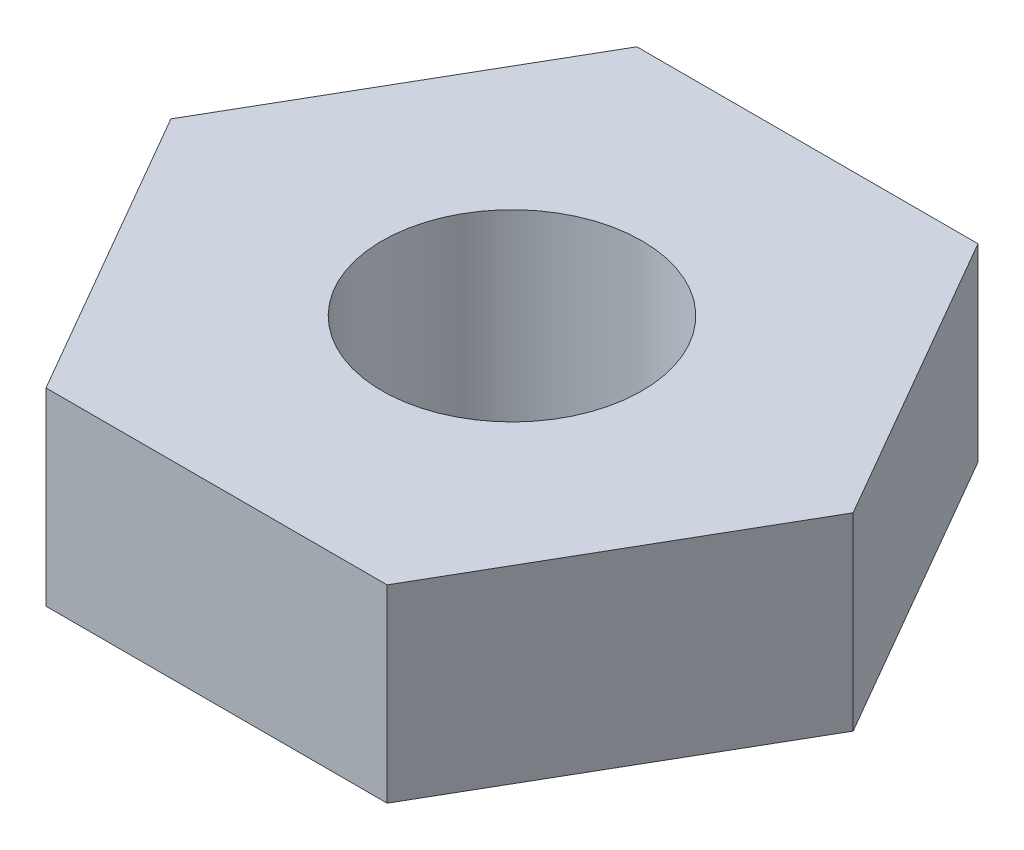
ISO-10303-21;
HEADER;
FILE_DESCRIPTION(('STEP AP214'),'2;1');
FILE_NAME('part.step','',(''),(''),'','','');
FILE_SCHEMA(('AUTOMOTIVE_DESIGN { 1 0 10303 214 1 1 1 1 }'));
ENDSEC;
DATA;
#1=APPLICATION_CONTEXT('core data for automotive mechanical design processes');
#2=APPLICATION_PROTOCOL_DEFINITION('international standard','automotive_design',2000,#1);
#3=PRODUCT_CONTEXT('',#1,'mechanical');
#4=PRODUCT('Part','Part','',(#3));
#5=PRODUCT_RELATED_PRODUCT_CATEGORY('part','',(#4));
#6=PRODUCT_DEFINITION_FORMATION('','',#4);
#7=PRODUCT_DEFINITION_CONTEXT('part definition',#1,'design');
#8=PRODUCT_DEFINITION('design','',#6,#7);
#9=PRODUCT_DEFINITION_SHAPE('','',#8);
#10=(LENGTH_UNIT() NAMED_UNIT(*) SI_UNIT(.MILLI.,.METRE.));
#11=(NAMED_UNIT(*) PLANE_ANGLE_UNIT() SI_UNIT($,.RADIAN.));
#12=(NAMED_UNIT(*) SI_UNIT($,.STERADIAN.) SOLID_ANGLE_UNIT());
#13=UNCERTAINTY_MEASURE_WITH_UNIT(LENGTH_MEASURE(1.E-05),#10,'distance_accuracy_value','');
#14=(GEOMETRIC_REPRESENTATION_CONTEXT(3) GLOBAL_UNCERTAINTY_ASSIGNED_CONTEXT((#13)) GLOBAL_UNIT_ASSIGNED_CONTEXT((#10,
#11,#12)) REPRESENTATION_CONTEXT('',''));
#15=CARTESIAN_POINT('',(0.,0.,0.));
#16=DIRECTION('',(0.,0.,1.));
#17=DIRECTION('',(1.,0.,0.));
#18=AXIS2_PLACEMENT_3D('',#15,#16,#17);
#19=CARTESIAN_POINT('',(0.72168793352628,0.8,-1.25000016807691));
#20=DIRECTION('',(0.,0.,1.));
#21=DIRECTION('',(1.,0.,0.));
#22=AXIS2_PLACEMENT_3D('',#19,#20,#21);
#23=PLANE('',#22);
#24=DIRECTION('',(-1.,0.,0.));
#25=VECTOR('',#24,1.);
#26=CARTESIAN_POINT('',(0.72168793352628,0.,-1.25000016807691));
#27=LINE('',#26,#25);
#28=CARTESIAN_POINT('',(0.72168793352628,0.,-1.25000016807691));
#29=VERTEX_POINT('',#28);
#30=CARTESIAN_POINT('',(-0.72168793352628,0.,-1.25000016807691));
#31=VERTEX_POINT('',#30);
#32=EDGE_CURVE('E116',#29,#31,#27,.T.);
#33=ORIENTED_EDGE('',*,*,#32,.T.);
#34=DIRECTION('',(0.,-1.,0.));
#35=VECTOR('',#34,1.);
#36=CARTESIAN_POINT('',(-0.72168793352628,0.8,-1.25000016807691));
#37=LINE('',#36,#35);
#38=CARTESIAN_POINT('',(-0.72168793352628,0.8,-1.25000016807691));
#39=VERTEX_POINT('',#38);
#40=EDGE_CURVE('E11',#39,#31,#37,.T.);
#41=ORIENTED_EDGE('',*,*,#40,.F.);
#42=DIRECTION('',(-1.,0.,0.));
#43=VECTOR('',#42,1.);
#44=CARTESIAN_POINT('',(0.72168793352628,0.8,-1.25000016807691));
#45=LINE('',#44,#43);
#46=CARTESIAN_POINT('',(0.72168793352628,0.8,-1.25000016807691));
#47=VERTEX_POINT('',#46);
#48=EDGE_CURVE('E127',#47,#39,#45,.T.);
#49=ORIENTED_EDGE('',*,*,#48,.F.);
#50=DIRECTION('',(0.,-1.,0.));
#51=VECTOR('',#50,1.);
#52=CARTESIAN_POINT('',(0.72168793352628,0.8,-1.25000016807691));
#53=LINE('',#52,#51);
#54=EDGE_CURVE('E112',#47,#29,#53,.T.);
#55=ORIENTED_EDGE('',*,*,#54,.T.);
#56=EDGE_LOOP('',(#33,#41,#49,#55));
#57=FACE_BOUND('',#56,.T.);
#58=ADVANCED_FACE('F32',(#57),#23,.F.);
#59=CARTESIAN_POINT('',(-0.72168793352628,0.8,-1.25000016807691));
#60=DIRECTION('',(0.866025403784439,0.,0.5));
#61=DIRECTION('',(0.5,0.,-0.866025403784439));
#62=AXIS2_PLACEMENT_3D('',#59,#60,#61);
#63=PLANE('',#62);
#64=DIRECTION('',(-0.5,0.,0.866025403784439));
#65=VECTOR('',#64,1.);
#66=CARTESIAN_POINT('',(-0.72168793352628,0.,-1.25000016807691));
#67=LINE('',#66,#65);
#68=CARTESIAN_POINT('',(-1.44337586705256,0.,0.));
#69=VERTEX_POINT('',#68);
#70=EDGE_CURVE('E119',#31,#69,#67,.T.);
#71=ORIENTED_EDGE('',*,*,#70,.T.);
#72=DIRECTION('',(0.,-1.,0.));
#73=VECTOR('',#72,1.);
#74=CARTESIAN_POINT('',(-1.44337586705256,0.8,0.));
#75=LINE('',#74,#73);
#76=CARTESIAN_POINT('',(-1.44337586705256,0.8,0.));
#77=VERTEX_POINT('',#76);
#78=EDGE_CURVE('E40',#77,#69,#75,.T.);
#79=ORIENTED_EDGE('',*,*,#78,.F.);
#80=DIRECTION('',(-0.5,0.,0.866025403784439));
#81=VECTOR('',#80,1.);
#82=CARTESIAN_POINT('',(-0.72168793352628,0.8,-1.25000016807691));
#83=LINE('',#82,#81);
#84=EDGE_CURVE('E85',#39,#77,#83,.T.);
#85=ORIENTED_EDGE('',*,*,#84,.F.);
#86=ORIENTED_EDGE('',*,*,#40,.T.);
#87=EDGE_LOOP('',(#71,#79,#85,#86));
#88=FACE_BOUND('',#87,.T.);
#89=ADVANCED_FACE('F152',(#88),#63,.F.);
#90=CARTESIAN_POINT('',(-1.44337586705256,0.8,0.));
#91=DIRECTION('',(0.866025403784439,0.,-0.5));
#92=DIRECTION('',(-0.5,0.,-0.866025403784439));
#93=AXIS2_PLACEMENT_3D('',#90,#91,#92);
#94=PLANE('',#93);
#95=DIRECTION('',(0.5,0.,0.866025403784439));
#96=VECTOR('',#95,1.);
#97=CARTESIAN_POINT('',(-1.44337586705256,0.,0.));
#98=LINE('',#97,#96);
#99=CARTESIAN_POINT('',(-0.721687933526281,0.,1.25000016807691));
#100=VERTEX_POINT('',#99);
#101=EDGE_CURVE('E122',#69,#100,#98,.T.);
#102=ORIENTED_EDGE('',*,*,#101,.T.);
#103=DIRECTION('',(0.,-1.,0.));
#104=VECTOR('',#103,1.);
#105=CARTESIAN_POINT('',(-0.721687933526281,0.8,1.25000016807691));
#106=LINE('',#105,#104);
#107=CARTESIAN_POINT('',(-0.721687933526281,0.8,1.25000016807691));
#108=VERTEX_POINT('',#107);
#109=EDGE_CURVE('E107',#108,#100,#106,.T.);
#110=ORIENTED_EDGE('',*,*,#109,.F.);
#111=DIRECTION('',(0.5,0.,0.866025403784439));
#112=VECTOR('',#111,1.);
#113=CARTESIAN_POINT('',(-1.44337586705256,0.8,0.));
#114=LINE('',#113,#112);
#115=EDGE_CURVE('E98',#77,#108,#114,.T.);
#116=ORIENTED_EDGE('',*,*,#115,.F.);
#117=ORIENTED_EDGE('',*,*,#78,.T.);
#118=EDGE_LOOP('',(#102,#110,#116,#117));
#119=FACE_BOUND('',#118,.T.);
#120=ADVANCED_FACE('F133',(#119),#94,.F.);
#121=CARTESIAN_POINT('',(-0.721687933526281,0.8,1.25000016807691));
#122=DIRECTION('',(0.,0.,-1.));
#123=DIRECTION('',(-1.,0.,0.));
#124=AXIS2_PLACEMENT_3D('',#121,#122,#123);
#125=PLANE('',#124);
#126=DIRECTION('',(1.,0.,0.));
#127=VECTOR('',#126,1.);
#128=CARTESIAN_POINT('',(-0.721687933526281,0.,1.25000016807691));
#129=LINE('',#128,#127);
#130=CARTESIAN_POINT('',(0.72168793352628,0.,1.25000016807691));
#131=VERTEX_POINT('',#130);
#132=EDGE_CURVE('E106',#100,#131,#129,.T.);
#133=ORIENTED_EDGE('',*,*,#132,.T.);
#134=DIRECTION('',(0.,-1.,0.));
#135=VECTOR('',#134,1.);
#136=CARTESIAN_POINT('',(0.72168793352628,0.8,1.25000016807691));
#137=LINE('',#136,#135);
#138=CARTESIAN_POINT('',(0.72168793352628,0.8,1.25000016807691));
#139=VERTEX_POINT('',#138);
#140=EDGE_CURVE('E103',#139,#131,#137,.T.);
#141=ORIENTED_EDGE('',*,*,#140,.F.);
#142=DIRECTION('',(1.,0.,0.));
#143=VECTOR('',#142,1.);
#144=CARTESIAN_POINT('',(-0.721687933526281,0.8,1.25000016807691));
#145=LINE('',#144,#143);
#146=EDGE_CURVE('E92',#108,#139,#145,.T.);
#147=ORIENTED_EDGE('',*,*,#146,.F.);
#148=ORIENTED_EDGE('',*,*,#109,.T.);
#149=EDGE_LOOP('',(#133,#141,#147,#148));
#150=FACE_BOUND('',#149,.T.);
#151=ADVANCED_FACE('F104',(#150),#125,.F.);
#152=CARTESIAN_POINT('',(0.72168793352628,0.8,1.25000016807691));
#153=DIRECTION('',(-0.866025403784439,0.,-0.5));
#154=DIRECTION('',(-0.5,0.,0.866025403784439));
#155=AXIS2_PLACEMENT_3D('',#152,#153,#154);
#156=PLANE('',#155);
#157=DIRECTION('',(0.5,0.,-0.866025403784439));
#158=VECTOR('',#157,1.);
#159=CARTESIAN_POINT('',(0.72168793352628,0.,1.25000016807691));
#160=LINE('',#159,#158);
#161=CARTESIAN_POINT('',(1.44337586705256,0.,0.));
#162=VERTEX_POINT('',#161);
#163=EDGE_CURVE('E71',#131,#162,#160,.T.);
#164=ORIENTED_EDGE('',*,*,#163,.T.);
#165=DIRECTION('',(0.,-1.,0.));
#166=VECTOR('',#165,1.);
#167=CARTESIAN_POINT('',(1.44337586705256,0.8,0.));
#168=LINE('',#167,#166);
#169=CARTESIAN_POINT('',(1.44337586705256,0.8,0.));
#170=VERTEX_POINT('',#169);
#171=EDGE_CURVE('E108',#170,#162,#168,.T.);
#172=ORIENTED_EDGE('',*,*,#171,.F.);
#173=DIRECTION('',(0.5,0.,-0.866025403784439));
#174=VECTOR('',#173,1.);
#175=CARTESIAN_POINT('',(0.72168793352628,0.8,1.25000016807691));
#176=LINE('',#175,#174);
#177=EDGE_CURVE('E96',#139,#170,#176,.T.);
#178=ORIENTED_EDGE('',*,*,#177,.F.);
#179=ORIENTED_EDGE('',*,*,#140,.T.);
#180=EDGE_LOOP('',(#164,#172,#178,#179));
#181=FACE_BOUND('',#180,.T.);
#182=ADVANCED_FACE('F110',(#181),#156,.F.);
#183=CARTESIAN_POINT('',(1.44337586705256,0.8,0.));
#184=DIRECTION('',(-0.866025403784439,0.,0.5));
#185=DIRECTION('',(0.5,0.,0.866025403784439));
#186=AXIS2_PLACEMENT_3D('',#183,#184,#185);
#187=PLANE('',#186);
#188=DIRECTION('',(-0.5,0.,-0.866025403784439));
#189=VECTOR('',#188,1.);
#190=CARTESIAN_POINT('',(1.44337586705256,0.,0.));
#191=LINE('',#190,#189);
#192=EDGE_CURVE('E77',#162,#29,#191,.T.);
#193=ORIENTED_EDGE('',*,*,#192,.T.);
#194=ORIENTED_EDGE('',*,*,#54,.F.);
#195=DIRECTION('',(-0.5,0.,-0.866025403784439));
#196=VECTOR('',#195,1.);
#197=CARTESIAN_POINT('',(1.44337586705256,0.8,0.));
#198=LINE('',#197,#196);
#199=EDGE_CURVE('E48',#170,#47,#198,.T.);
#200=ORIENTED_EDGE('',*,*,#199,.F.);
#201=ORIENTED_EDGE('',*,*,#171,.T.);
#202=EDGE_LOOP('',(#193,#194,#200,#201));
#203=FACE_BOUND('',#202,.T.);
#204=ADVANCED_FACE('F140',(#203),#187,.F.);
#205=CARTESIAN_POINT('',(0.,0.8,0.));
#206=DIRECTION('',(0.,1.,0.));
#207=DIRECTION('',(0.,0.,1.));
#208=AXIS2_PLACEMENT_3D('',#205,#206,#207);
#209=PLANE('',#208);
#210=CARTESIAN_POINT('',(0.,0.8,0.));
#211=DIRECTION('',(0.,-1.,0.));
#212=DIRECTION('',(0.,0.,-1.));
#213=AXIS2_PLACEMENT_3D('',#210,#211,#212);
#214=CIRCLE('',#213,0.55);
#215=CARTESIAN_POINT('',(0.,0.8,-0.55));
#216=VERTEX_POINT('',#215);
#217=EDGE_CURVE('E120',#216,#216,#214,.T.);
#218=ORIENTED_EDGE('',*,*,#217,.T.);
#219=EDGE_LOOP('',(#218));
#220=FACE_BOUND('',#219,.T.);
#221=ORIENTED_EDGE('',*,*,#48,.T.);
#222=ORIENTED_EDGE('',*,*,#84,.T.);
#223=ORIENTED_EDGE('',*,*,#115,.T.);
#224=ORIENTED_EDGE('',*,*,#146,.T.);
#225=ORIENTED_EDGE('',*,*,#177,.T.);
#226=ORIENTED_EDGE('',*,*,#199,.T.);
#227=EDGE_LOOP('',(#221,#222,#223,#224,#225,#226));
#228=FACE_BOUND('',#227,.T.);
#229=ADVANCED_FACE('F94',(#220,#228),#209,.T.);
#230=CARTESIAN_POINT('',(0.,0.,0.));
#231=DIRECTION('',(0.,1.,0.));
#232=DIRECTION('',(0.,0.,1.));
#233=AXIS2_PLACEMENT_3D('',#230,#231,#232);
#234=PLANE('',#233);
#235=CARTESIAN_POINT('',(0.,0.,0.));
#236=DIRECTION('',(0.,-1.,0.));
#237=DIRECTION('',(0.,0.,-1.));
#238=AXIS2_PLACEMENT_3D('',#235,#236,#237);
#239=CIRCLE('',#238,0.55);
#240=CARTESIAN_POINT('',(0.,0.,-0.55));
#241=VERTEX_POINT('',#240);
#242=EDGE_CURVE('E207',#241,#241,#239,.T.);
#243=ORIENTED_EDGE('',*,*,#242,.F.);
#244=EDGE_LOOP('',(#243));
#245=FACE_BOUND('',#244,.T.);
#246=ORIENTED_EDGE('',*,*,#32,.F.);
#247=ORIENTED_EDGE('',*,*,#192,.F.);
#248=ORIENTED_EDGE('',*,*,#163,.F.);
#249=ORIENTED_EDGE('',*,*,#132,.F.);
#250=ORIENTED_EDGE('',*,*,#101,.F.);
#251=ORIENTED_EDGE('',*,*,#70,.F.);
#252=EDGE_LOOP('',(#246,#247,#248,#249,#250,#251));
#253=FACE_BOUND('',#252,.T.);
#254=ADVANCED_FACE('F136',(#245,#253),#234,.F.);
#255=CARTESIAN_POINT('',(0.,0.8,0.));
#256=DIRECTION('',(0.,-1.,0.));
#257=DIRECTION('',(0.,0.,-1.));
#258=AXIS2_PLACEMENT_3D('',#255,#256,#257);
#259=CYLINDRICAL_SURFACE('',#258,0.55);
#260=ORIENTED_EDGE('',*,*,#217,.F.);
#261=EDGE_LOOP('',(#260));
#262=FACE_BOUND('',#261,.T.);
#263=ORIENTED_EDGE('',*,*,#242,.T.);
#264=EDGE_LOOP('',(#263));
#265=FACE_BOUND('',#264,.T.);
#266=ADVANCED_FACE('F189',(#262,#265),#259,.F.);
#267=CLOSED_SHELL('',(#58,#89,#120,#151,#182,#204,#229,#254,#266));
#268=MANIFOLD_SOLID_BREP('B2',#267);
#269=ADVANCED_BREP_SHAPE_REPRESENTATION('',(#18,#268),#14);
#270=SHAPE_DEFINITION_REPRESENTATION(#9,#269);
ENDSEC;
END-ISO-10303-21;
